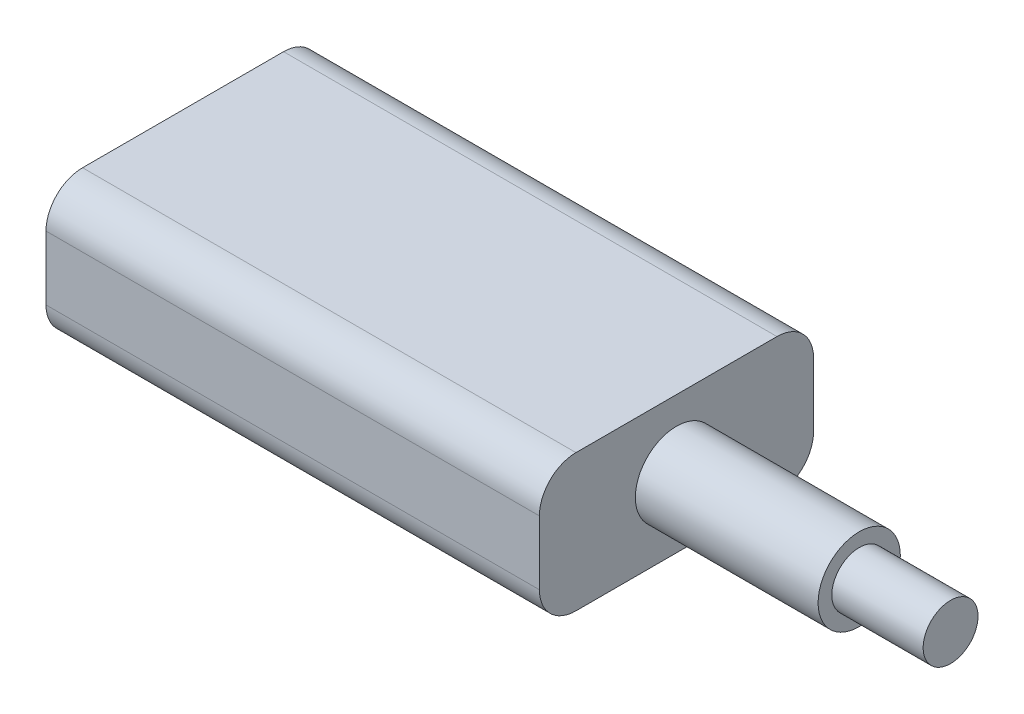
ISO-10303-21;
HEADER;
FILE_DESCRIPTION(('STEP AP214'),'2;1');
FILE_NAME('part.step','',(''),(''),'','','');
FILE_SCHEMA(('AUTOMOTIVE_DESIGN { 1 0 10303 214 1 1 1 1 }'));
ENDSEC;
DATA;
#1=APPLICATION_CONTEXT('core data for automotive mechanical design processes');
#2=APPLICATION_PROTOCOL_DEFINITION('international standard','automotive_design',2000,#1);
#3=PRODUCT_CONTEXT('',#1,'mechanical');
#4=PRODUCT('Part','Part','',(#3));
#5=PRODUCT_RELATED_PRODUCT_CATEGORY('part','',(#4));
#6=PRODUCT_DEFINITION_FORMATION('','',#4);
#7=PRODUCT_DEFINITION_CONTEXT('part definition',#1,'design');
#8=PRODUCT_DEFINITION('design','',#6,#7);
#9=PRODUCT_DEFINITION_SHAPE('','',#8);
#10=(LENGTH_UNIT() NAMED_UNIT(*) SI_UNIT(.MILLI.,.METRE.));
#11=(NAMED_UNIT(*) PLANE_ANGLE_UNIT() SI_UNIT($,.RADIAN.));
#12=(NAMED_UNIT(*) SI_UNIT($,.STERADIAN.) SOLID_ANGLE_UNIT());
#13=UNCERTAINTY_MEASURE_WITH_UNIT(LENGTH_MEASURE(1.E-05),#10,'distance_accuracy_value','');
#14=(GEOMETRIC_REPRESENTATION_CONTEXT(3) GLOBAL_UNCERTAINTY_ASSIGNED_CONTEXT((#13)) GLOBAL_UNIT_ASSIGNED_CONTEXT((#10,
#11,#12)) REPRESENTATION_CONTEXT('',''));
#15=CARTESIAN_POINT('',(0.,0.,0.));
#16=DIRECTION('',(0.,0.,1.));
#17=DIRECTION('',(1.,0.,0.));
#18=AXIS2_PLACEMENT_3D('',#15,#16,#17);
#19=CARTESIAN_POINT('',(37.,0.,0.));
#20=DIRECTION('',(1.,0.,0.));
#21=DIRECTION('',(0.,0.,-1.));
#22=AXIS2_PLACEMENT_3D('',#19,#20,#21);
#23=PLANE('',#22);
#24=CARTESIAN_POINT('',(37.,3.75,-7.5));
#25=DIRECTION('',(1.,0.,0.));
#26=DIRECTION('',(0.,0.,-1.));
#27=AXIS2_PLACEMENT_3D('',#24,#25,#26);
#28=CIRCLE('',#27,2.25);
#29=CARTESIAN_POINT('',(37.,3.75,-9.75));
#30=VERTEX_POINT('',#29);
#31=EDGE_CURVE('E168',#30,#30,#28,.T.);
#32=ORIENTED_EDGE('',*,*,#31,.T.);
#33=EDGE_LOOP('',(#32));
#34=FACE_BOUND('',#33,.T.);
#35=CARTESIAN_POINT('',(37.,3.75,-7.5));
#36=DIRECTION('',(1.,0.,0.));
#37=DIRECTION('',(0.,0.,-1.));
#38=AXIS2_PLACEMENT_3D('',#35,#36,#37);
#39=CIRCLE('',#38,1.5);
#40=CARTESIAN_POINT('',(37.,3.75,-9.));
#41=VERTEX_POINT('',#40);
#42=EDGE_CURVE('E161',#41,#41,#39,.T.);
#43=ORIENTED_EDGE('',*,*,#42,.F.);
#44=EDGE_LOOP('',(#43));
#45=FACE_BOUND('',#44,.T.);
#46=ADVANCED_FACE('F36',(#34,#45),#23,.T.);
#47=CARTESIAN_POINT('',(27.,7.5,-15.));
#48=DIRECTION('',(-1.,0.,0.));
#49=DIRECTION('',(0.,0.,1.));
#50=AXIS2_PLACEMENT_3D('',#47,#48,#49);
#51=PLANE('',#50);
#52=DIRECTION('',(0.,-1.,0.));
#53=VECTOR('',#52,1.);
#54=CARTESIAN_POINT('',(27.,7.5,0.));
#55=LINE('',#54,#53);
#56=CARTESIAN_POINT('',(27.,5.5,0.));
#57=VERTEX_POINT('',#56);
#58=CARTESIAN_POINT('',(27.,2.,0.));
#59=VERTEX_POINT('',#58);
#60=EDGE_CURVE('E194',#57,#59,#55,.T.);
#61=ORIENTED_EDGE('',*,*,#60,.T.);
#62=CARTESIAN_POINT('',(27.,2.,-2.));
#63=DIRECTION('',(-1.,0.,0.));
#64=DIRECTION('',(0.,0.,1.));
#65=AXIS2_PLACEMENT_3D('',#62,#63,#64);
#66=CIRCLE('',#65,2.);
#67=CARTESIAN_POINT('',(27.,0.,-2.));
#68=VERTEX_POINT('',#67);
#69=EDGE_CURVE('E211',#59,#68,#66,.F.);
#70=ORIENTED_EDGE('',*,*,#69,.T.);
#71=DIRECTION('',(0.,0.,-1.));
#72=VECTOR('',#71,1.);
#73=CARTESIAN_POINT('',(27.,0.,-15.));
#74=LINE('',#73,#72);
#75=CARTESIAN_POINT('',(27.,0.,-13.));
#76=VERTEX_POINT('',#75);
#77=EDGE_CURVE('E173',#68,#76,#74,.T.);
#78=ORIENTED_EDGE('',*,*,#77,.T.);
#79=CARTESIAN_POINT('',(27.,2.,-13.));
#80=DIRECTION('',(-1.,0.,0.));
#81=DIRECTION('',(0.,0.,1.));
#82=AXIS2_PLACEMENT_3D('',#79,#80,#81);
#83=CIRCLE('',#82,2.);
#84=CARTESIAN_POINT('',(27.,2.,-15.));
#85=VERTEX_POINT('',#84);
#86=EDGE_CURVE('E209',#76,#85,#83,.F.);
#87=ORIENTED_EDGE('',*,*,#86,.T.);
#88=DIRECTION('',(0.,-1.,0.));
#89=VECTOR('',#88,1.);
#90=CARTESIAN_POINT('',(27.,7.5,-15.));
#91=LINE('',#90,#89);
#92=CARTESIAN_POINT('',(27.,5.5,-15.));
#93=VERTEX_POINT('',#92);
#94=EDGE_CURVE('E191',#93,#85,#91,.T.);
#95=ORIENTED_EDGE('',*,*,#94,.F.);
#96=CARTESIAN_POINT('',(27.,5.5,-13.));
#97=DIRECTION('',(-1.,0.,0.));
#98=DIRECTION('',(0.,0.,1.));
#99=AXIS2_PLACEMENT_3D('',#96,#97,#98);
#100=CIRCLE('',#99,2.);
#101=CARTESIAN_POINT('',(27.,7.5,-13.));
#102=VERTEX_POINT('',#101);
#103=EDGE_CURVE('E205',#93,#102,#100,.F.);
#104=ORIENTED_EDGE('',*,*,#103,.T.);
#105=DIRECTION('',(0.,0.,-1.));
#106=VECTOR('',#105,1.);
#107=CARTESIAN_POINT('',(27.,7.5,-15.));
#108=LINE('',#107,#106);
#109=CARTESIAN_POINT('',(27.,7.5,-2.));
#110=VERTEX_POINT('',#109);
#111=EDGE_CURVE('E174',#110,#102,#108,.T.);
#112=ORIENTED_EDGE('',*,*,#111,.F.);
#113=CARTESIAN_POINT('',(27.,5.5,-2.));
#114=DIRECTION('',(-1.,0.,0.));
#115=DIRECTION('',(0.,0.,1.));
#116=AXIS2_PLACEMENT_3D('',#113,#114,#115);
#117=CIRCLE('',#116,2.);
#118=EDGE_CURVE('E207',#110,#57,#117,.F.);
#119=ORIENTED_EDGE('',*,*,#118,.T.);
#120=EDGE_LOOP('',(#61,#70,#78,#87,#95,#104,#112,#119));
#121=FACE_BOUND('',#120,.T.);
#122=CARTESIAN_POINT('',(27.,3.75,-7.5));
#123=DIRECTION('',(-1.,0.,0.));
#124=DIRECTION('',(0.,0.,1.));
#125=AXIS2_PLACEMENT_3D('',#122,#123,#124);
#126=CIRCLE('',#125,2.25);
#127=CARTESIAN_POINT('',(27.,3.75,-5.25));
#128=VERTEX_POINT('',#127);
#129=EDGE_CURVE('E197',#128,#128,#126,.F.);
#130=ORIENTED_EDGE('',*,*,#129,.F.);
#131=EDGE_LOOP('',(#130));
#132=FACE_BOUND('',#131,.T.);
#133=ADVANCED_FACE('F245',(#121,#132),#51,.F.);
#134=CARTESIAN_POINT('',(27.,7.5,0.));
#135=DIRECTION('',(0.,0.,-1.));
#136=DIRECTION('',(-1.,0.,0.));
#137=AXIS2_PLACEMENT_3D('',#134,#135,#136);
#138=PLANE('',#137);
#139=DIRECTION('',(0.,-1.,0.));
#140=VECTOR('',#139,1.);
#141=CARTESIAN_POINT('',(0.,7.5,0.));
#142=LINE('',#141,#140);
#143=CARTESIAN_POINT('',(0.,5.5,0.));
#144=VERTEX_POINT('',#143);
#145=CARTESIAN_POINT('',(0.,2.,0.));
#146=VERTEX_POINT('',#145);
#147=EDGE_CURVE('E181',#144,#146,#142,.T.);
#148=ORIENTED_EDGE('',*,*,#147,.T.);
#149=DIRECTION('',(1.,0.,0.));
#150=VECTOR('',#149,1.);
#151=CARTESIAN_POINT('',(27.,2.,0.));
#152=LINE('',#151,#150);
#153=EDGE_CURVE('E202',#146,#59,#152,.T.);
#154=ORIENTED_EDGE('',*,*,#153,.T.);
#155=ORIENTED_EDGE('',*,*,#60,.F.);
#156=DIRECTION('',(1.,0.,0.));
#157=VECTOR('',#156,1.);
#158=CARTESIAN_POINT('',(27.,5.5,0.));
#159=LINE('',#158,#157);
#160=EDGE_CURVE('E200',#57,#144,#159,.F.);
#161=ORIENTED_EDGE('',*,*,#160,.T.);
#162=EDGE_LOOP('',(#148,#154,#155,#161));
#163=FACE_BOUND('',#162,.T.);
#164=ADVANCED_FACE('F264',(#163),#138,.F.);
#165=CARTESIAN_POINT('',(0.,7.5,-15.));
#166=DIRECTION('',(0.,0.,1.));
#167=DIRECTION('',(1.,0.,0.));
#168=AXIS2_PLACEMENT_3D('',#165,#166,#167);
#169=PLANE('',#168);
#170=ORIENTED_EDGE('',*,*,#94,.T.);
#171=DIRECTION('',(-1.,0.,0.));
#172=VECTOR('',#171,1.);
#173=CARTESIAN_POINT('',(0.,2.,-15.));
#174=LINE('',#173,#172);
#175=CARTESIAN_POINT('',(0.,2.,-15.));
#176=VERTEX_POINT('',#175);
#177=EDGE_CURVE('E226',#85,#176,#174,.T.);
#178=ORIENTED_EDGE('',*,*,#177,.T.);
#179=DIRECTION('',(0.,-1.,0.));
#180=VECTOR('',#179,1.);
#181=CARTESIAN_POINT('',(0.,7.5,-15.));
#182=LINE('',#181,#180);
#183=CARTESIAN_POINT('',(0.,5.5,-15.));
#184=VERTEX_POINT('',#183);
#185=EDGE_CURVE('E188',#184,#176,#182,.T.);
#186=ORIENTED_EDGE('',*,*,#185,.F.);
#187=DIRECTION('',(-1.,0.,0.));
#188=VECTOR('',#187,1.);
#189=CARTESIAN_POINT('',(0.,5.5,-15.));
#190=LINE('',#189,#188);
#191=EDGE_CURVE('E224',#184,#93,#190,.F.);
#192=ORIENTED_EDGE('',*,*,#191,.T.);
#193=EDGE_LOOP('',(#170,#178,#186,#192));
#194=FACE_BOUND('',#193,.T.);
#195=ADVANCED_FACE('F251',(#194),#169,.F.);
#196=CARTESIAN_POINT('',(0.,7.5,0.));
#197=DIRECTION('',(1.,0.,0.));
#198=DIRECTION('',(0.,0.,-1.));
#199=AXIS2_PLACEMENT_3D('',#196,#197,#198);
#200=PLANE('',#199);
#201=DIRECTION('',(0.,0.,1.));
#202=VECTOR('',#201,1.);
#203=CARTESIAN_POINT('',(0.,3.5,-2.));
#204=LINE('',#203,#202);
#205=CARTESIAN_POINT('',(0.,3.5,-13.));
#206=VERTEX_POINT('',#205);
#207=CARTESIAN_POINT('',(0.,3.5,-2.));
#208=VERTEX_POINT('',#207);
#209=EDGE_CURVE('E155',#206,#208,#204,.T.);
#210=ORIENTED_EDGE('',*,*,#209,.F.);
#211=DIRECTION('',(0.,-1.,0.));
#212=VECTOR('',#211,1.);
#213=CARTESIAN_POINT('',(0.,3.5,-13.));
#214=LINE('',#213,#212);
#215=CARTESIAN_POINT('',(0.,6.5,-13.));
#216=VERTEX_POINT('',#215);
#217=EDGE_CURVE('E51',#216,#206,#214,.T.);
#218=ORIENTED_EDGE('',*,*,#217,.F.);
#219=DIRECTION('',(0.,0.,-1.));
#220=VECTOR('',#219,1.);
#221=CARTESIAN_POINT('',(0.,6.5,-13.));
#222=LINE('',#221,#220);
#223=CARTESIAN_POINT('',(0.,6.5,-2.));
#224=VERTEX_POINT('',#223);
#225=EDGE_CURVE('E146',#224,#216,#222,.T.);
#226=ORIENTED_EDGE('',*,*,#225,.F.);
#227=DIRECTION('',(0.,1.,0.));
#228=VECTOR('',#227,1.);
#229=CARTESIAN_POINT('',(0.,6.5,-2.));
#230=LINE('',#229,#228);
#231=EDGE_CURVE('E149',#208,#224,#230,.T.);
#232=ORIENTED_EDGE('',*,*,#231,.F.);
#233=EDGE_LOOP('',(#210,#218,#226,#232));
#234=FACE_BOUND('',#233,.T.);
#235=DIRECTION('',(0.,0.,1.));
#236=VECTOR('',#235,1.);
#237=CARTESIAN_POINT('',(0.,0.,0.));
#238=LINE('',#237,#236);
#239=CARTESIAN_POINT('',(0.,0.,-13.));
#240=VERTEX_POINT('',#239);
#241=CARTESIAN_POINT('',(0.,0.,-2.));
#242=VERTEX_POINT('',#241);
#243=EDGE_CURVE('E178',#240,#242,#238,.T.);
#244=ORIENTED_EDGE('',*,*,#243,.T.);
#245=CARTESIAN_POINT('',(0.,2.,-2.));
#246=DIRECTION('',(1.,0.,0.));
#247=DIRECTION('',(0.,0.,-1.));
#248=AXIS2_PLACEMENT_3D('',#245,#246,#247);
#249=CIRCLE('',#248,2.);
#250=EDGE_CURVE('E222',#242,#146,#249,.F.);
#251=ORIENTED_EDGE('',*,*,#250,.T.);
#252=ORIENTED_EDGE('',*,*,#147,.F.);
#253=CARTESIAN_POINT('',(0.,5.5,-2.));
#254=DIRECTION('',(1.,0.,0.));
#255=DIRECTION('',(0.,0.,-1.));
#256=AXIS2_PLACEMENT_3D('',#253,#254,#255);
#257=CIRCLE('',#256,2.);
#258=CARTESIAN_POINT('',(0.,7.5,-2.));
#259=VERTEX_POINT('',#258);
#260=EDGE_CURVE('E219',#144,#259,#257,.F.);
#261=ORIENTED_EDGE('',*,*,#260,.T.);
#262=DIRECTION('',(0.,0.,1.));
#263=VECTOR('',#262,1.);
#264=CARTESIAN_POINT('',(0.,7.5,0.));
#265=LINE('',#264,#263);
#266=CARTESIAN_POINT('',(0.,7.5,-13.));
#267=VERTEX_POINT('',#266);
#268=EDGE_CURVE('E177',#267,#259,#265,.T.);
#269=ORIENTED_EDGE('',*,*,#268,.F.);
#270=CARTESIAN_POINT('',(0.,5.5,-13.));
#271=DIRECTION('',(1.,0.,0.));
#272=DIRECTION('',(0.,0.,-1.));
#273=AXIS2_PLACEMENT_3D('',#270,#271,#272);
#274=CIRCLE('',#273,2.);
#275=EDGE_CURVE('E217',#267,#184,#274,.F.);
#276=ORIENTED_EDGE('',*,*,#275,.T.);
#277=ORIENTED_EDGE('',*,*,#185,.T.);
#278=CARTESIAN_POINT('',(0.,2.,-13.));
#279=DIRECTION('',(1.,0.,0.));
#280=DIRECTION('',(0.,0.,-1.));
#281=AXIS2_PLACEMENT_3D('',#278,#279,#280);
#282=CIRCLE('',#281,2.);
#283=EDGE_CURVE('E59',#176,#240,#282,.F.);
#284=ORIENTED_EDGE('',*,*,#283,.T.);
#285=EDGE_LOOP('',(#244,#251,#252,#261,#269,#276,#277,#284));
#286=FACE_BOUND('',#285,.T.);
#287=ADVANCED_FACE('F237',(#234,#286),#200,.F.);
#288=CARTESIAN_POINT('',(0.,7.5,0.));
#289=DIRECTION('',(0.,-1.,0.));
#290=DIRECTION('',(0.,0.,-1.));
#291=AXIS2_PLACEMENT_3D('',#288,#289,#290);
#292=PLANE('',#291);
#293=ORIENTED_EDGE('',*,*,#268,.T.);
#294=DIRECTION('',(1.,0.,0.));
#295=VECTOR('',#294,1.);
#296=CARTESIAN_POINT('',(0.,7.5,-2.));
#297=LINE('',#296,#295);
#298=EDGE_CURVE('E11',#259,#110,#297,.T.);
#299=ORIENTED_EDGE('',*,*,#298,.T.);
#300=ORIENTED_EDGE('',*,*,#111,.T.);
#301=DIRECTION('',(-1.,0.,0.));
#302=VECTOR('',#301,1.);
#303=CARTESIAN_POINT('',(0.,7.5,-13.));
#304=LINE('',#303,#302);
#305=EDGE_CURVE('E44',#102,#267,#304,.T.);
#306=ORIENTED_EDGE('',*,*,#305,.T.);
#307=EDGE_LOOP('',(#293,#299,#300,#306));
#308=FACE_BOUND('',#307,.T.);
#309=ADVANCED_FACE('F231',(#308),#292,.F.);
#310=CARTESIAN_POINT('',(0.,0.,0.));
#311=DIRECTION('',(0.,-1.,0.));
#312=DIRECTION('',(0.,0.,-1.));
#313=AXIS2_PLACEMENT_3D('',#310,#311,#312);
#314=PLANE('',#313);
#315=ORIENTED_EDGE('',*,*,#77,.F.);
#316=DIRECTION('',(1.,0.,0.));
#317=VECTOR('',#316,1.);
#318=CARTESIAN_POINT('',(0.,0.,-2.));
#319=LINE('',#318,#317);
#320=EDGE_CURVE('E215',#68,#242,#319,.F.);
#321=ORIENTED_EDGE('',*,*,#320,.T.);
#322=ORIENTED_EDGE('',*,*,#243,.F.);
#323=DIRECTION('',(-1.,0.,0.));
#324=VECTOR('',#323,1.);
#325=CARTESIAN_POINT('',(27.,0.,-13.));
#326=LINE('',#325,#324);
#327=EDGE_CURVE('E213',#240,#76,#326,.F.);
#328=ORIENTED_EDGE('',*,*,#327,.T.);
#329=EDGE_LOOP('',(#315,#321,#322,#328));
#330=FACE_BOUND('',#329,.T.);
#331=ADVANCED_FACE('F256',(#330),#314,.T.);
#332=CARTESIAN_POINT('',(37.,3.75,-7.5));
#333=DIRECTION('',(-1.,0.,0.));
#334=DIRECTION('',(0.,0.,1.));
#335=AXIS2_PLACEMENT_3D('',#332,#333,#334);
#336=CYLINDRICAL_SURFACE('',#335,2.25);
#337=ORIENTED_EDGE('',*,*,#31,.F.);
#338=EDGE_LOOP('',(#337));
#339=FACE_BOUND('',#338,.T.);
#340=ORIENTED_EDGE('',*,*,#129,.T.);
#341=EDGE_LOOP('',(#340));
#342=FACE_BOUND('',#341,.T.);
#343=ADVANCED_FACE('F284',(#339,#342),#336,.T.);
#344=CARTESIAN_POINT('',(42.,3.75,-7.5));
#345=DIRECTION('',(-1.,0.,0.));
#346=DIRECTION('',(0.,0.,1.));
#347=AXIS2_PLACEMENT_3D('',#344,#345,#346);
#348=CYLINDRICAL_SURFACE('',#347,1.5);
#349=CARTESIAN_POINT('',(42.,3.75,-7.5));
#350=DIRECTION('',(1.,0.,0.));
#351=DIRECTION('',(0.,0.,-1.));
#352=AXIS2_PLACEMENT_3D('',#349,#350,#351);
#353=CIRCLE('',#352,1.5);
#354=CARTESIAN_POINT('',(42.,3.75,-9.));
#355=VERTEX_POINT('',#354);
#356=EDGE_CURVE('E165',#355,#355,#353,.T.);
#357=ORIENTED_EDGE('',*,*,#356,.F.);
#358=EDGE_LOOP('',(#357));
#359=FACE_BOUND('',#358,.T.);
#360=ORIENTED_EDGE('',*,*,#42,.T.);
#361=EDGE_LOOP('',(#360));
#362=FACE_BOUND('',#361,.T.);
#363=ADVANCED_FACE('F282',(#359,#362),#348,.T.);
#364=CARTESIAN_POINT('',(42.,3.75,-7.5));
#365=DIRECTION('',(1.,0.,0.));
#366=DIRECTION('',(0.,0.,-1.));
#367=AXIS2_PLACEMENT_3D('',#364,#365,#366);
#368=PLANE('',#367);
#369=ORIENTED_EDGE('',*,*,#356,.T.);
#370=EDGE_LOOP('',(#369));
#371=FACE_BOUND('',#370,.T.);
#372=ADVANCED_FACE('F313',(#371),#368,.T.);
#373=CARTESIAN_POINT('',(27.,2.,-2.));
#374=DIRECTION('',(-1.,0.,0.));
#375=DIRECTION('',(0.,0.,1.));
#376=AXIS2_PLACEMENT_3D('',#373,#374,#375);
#377=CYLINDRICAL_SURFACE('',#376,2.);
#378=ORIENTED_EDGE('',*,*,#250,.F.);
#379=ORIENTED_EDGE('',*,*,#320,.F.);
#380=ORIENTED_EDGE('',*,*,#69,.F.);
#381=ORIENTED_EDGE('',*,*,#153,.F.);
#382=EDGE_LOOP('',(#378,#379,#380,#381));
#383=FACE_BOUND('',#382,.T.);
#384=ADVANCED_FACE('F261',(#383),#377,.T.);
#385=CARTESIAN_POINT('',(0.,2.,-13.));
#386=DIRECTION('',(1.,0.,0.));
#387=DIRECTION('',(0.,0.,-1.));
#388=AXIS2_PLACEMENT_3D('',#385,#386,#387);
#389=CYLINDRICAL_SURFACE('',#388,2.);
#390=ORIENTED_EDGE('',*,*,#86,.F.);
#391=ORIENTED_EDGE('',*,*,#327,.F.);
#392=ORIENTED_EDGE('',*,*,#283,.F.);
#393=ORIENTED_EDGE('',*,*,#177,.F.);
#394=EDGE_LOOP('',(#390,#391,#392,#393));
#395=FACE_BOUND('',#394,.T.);
#396=ADVANCED_FACE('F259',(#395),#389,.T.);
#397=CARTESIAN_POINT('',(0.,5.5,-2.));
#398=DIRECTION('',(1.,0.,0.));
#399=DIRECTION('',(0.,0.,-1.));
#400=AXIS2_PLACEMENT_3D('',#397,#398,#399);
#401=CYLINDRICAL_SURFACE('',#400,2.);
#402=ORIENTED_EDGE('',*,*,#260,.F.);
#403=ORIENTED_EDGE('',*,*,#160,.F.);
#404=ORIENTED_EDGE('',*,*,#118,.F.);
#405=ORIENTED_EDGE('',*,*,#298,.F.);
#406=EDGE_LOOP('',(#402,#403,#404,#405));
#407=FACE_BOUND('',#406,.T.);
#408=ADVANCED_FACE('F243',(#407),#401,.T.);
#409=CARTESIAN_POINT('',(0.,5.5,-13.));
#410=DIRECTION('',(-1.,0.,0.));
#411=DIRECTION('',(0.,0.,1.));
#412=AXIS2_PLACEMENT_3D('',#409,#410,#411);
#413=CYLINDRICAL_SURFACE('',#412,2.);
#414=ORIENTED_EDGE('',*,*,#103,.F.);
#415=ORIENTED_EDGE('',*,*,#191,.F.);
#416=ORIENTED_EDGE('',*,*,#275,.F.);
#417=ORIENTED_EDGE('',*,*,#305,.F.);
#418=EDGE_LOOP('',(#414,#415,#416,#417));
#419=FACE_BOUND('',#418,.T.);
#420=ADVANCED_FACE('F38',(#419),#413,.T.);
#421=CARTESIAN_POINT('',(10.,3.5,-13.));
#422=DIRECTION('',(0.,0.,-1.));
#423=DIRECTION('',(-1.,0.,0.));
#424=AXIS2_PLACEMENT_3D('',#421,#422,#423);
#425=PLANE('',#424);
#426=ORIENTED_EDGE('',*,*,#217,.T.);
#427=DIRECTION('',(-1.,0.,0.));
#428=VECTOR('',#427,1.);
#429=CARTESIAN_POINT('',(10.,3.5,-13.));
#430=LINE('',#429,#428);
#431=CARTESIAN_POINT('',(10.,3.5,-13.));
#432=VERTEX_POINT('',#431);
#433=EDGE_CURVE('E124',#432,#206,#430,.T.);
#434=ORIENTED_EDGE('',*,*,#433,.F.);
#435=DIRECTION('',(0.,-1.,0.));
#436=VECTOR('',#435,1.);
#437=CARTESIAN_POINT('',(10.,3.5,-13.));
#438=LINE('',#437,#436);
#439=CARTESIAN_POINT('',(10.,6.5,-13.));
#440=VERTEX_POINT('',#439);
#441=EDGE_CURVE('E128',#440,#432,#438,.T.);
#442=ORIENTED_EDGE('',*,*,#441,.F.);
#443=DIRECTION('',(-1.,0.,0.));
#444=VECTOR('',#443,1.);
#445=CARTESIAN_POINT('',(10.,6.5,-13.));
#446=LINE('',#445,#444);
#447=EDGE_CURVE('E159',#440,#216,#446,.T.);
#448=ORIENTED_EDGE('',*,*,#447,.T.);
#449=EDGE_LOOP('',(#426,#434,#442,#448));
#450=FACE_BOUND('',#449,.T.);
#451=ADVANCED_FACE('F126',(#450),#425,.F.);
#452=CARTESIAN_POINT('',(10.,6.5,-13.));
#453=DIRECTION('',(0.,1.,0.));
#454=DIRECTION('',(0.,0.,1.));
#455=AXIS2_PLACEMENT_3D('',#452,#453,#454);
#456=PLANE('',#455);
#457=ORIENTED_EDGE('',*,*,#225,.T.);
#458=ORIENTED_EDGE('',*,*,#447,.F.);
#459=DIRECTION('',(0.,0.,-1.));
#460=VECTOR('',#459,1.);
#461=CARTESIAN_POINT('',(10.,6.5,-13.));
#462=LINE('',#461,#460);
#463=CARTESIAN_POINT('',(10.,6.5,-2.));
#464=VERTEX_POINT('',#463);
#465=EDGE_CURVE('E134',#464,#440,#462,.T.);
#466=ORIENTED_EDGE('',*,*,#465,.F.);
#467=DIRECTION('',(-1.,0.,0.));
#468=VECTOR('',#467,1.);
#469=CARTESIAN_POINT('',(10.,6.5,-2.));
#470=LINE('',#469,#468);
#471=EDGE_CURVE('E162',#464,#224,#470,.T.);
#472=ORIENTED_EDGE('',*,*,#471,.T.);
#473=EDGE_LOOP('',(#457,#458,#466,#472));
#474=FACE_BOUND('',#473,.T.);
#475=ADVANCED_FACE('F301',(#474),#456,.F.);
#476=CARTESIAN_POINT('',(10.,6.5,-2.));
#477=DIRECTION('',(0.,0.,1.));
#478=DIRECTION('',(1.,0.,0.));
#479=AXIS2_PLACEMENT_3D('',#476,#477,#478);
#480=PLANE('',#479);
#481=ORIENTED_EDGE('',*,*,#231,.T.);
#482=ORIENTED_EDGE('',*,*,#471,.F.);
#483=DIRECTION('',(0.,1.,0.));
#484=VECTOR('',#483,1.);
#485=CARTESIAN_POINT('',(10.,6.5,-2.));
#486=LINE('',#485,#484);
#487=CARTESIAN_POINT('',(10.,3.5,-2.));
#488=VERTEX_POINT('',#487);
#489=EDGE_CURVE('E142',#488,#464,#486,.T.);
#490=ORIENTED_EDGE('',*,*,#489,.F.);
#491=DIRECTION('',(-1.,0.,0.));
#492=VECTOR('',#491,1.);
#493=CARTESIAN_POINT('',(10.,3.5,-2.));
#494=LINE('',#493,#492);
#495=EDGE_CURVE('E133',#488,#208,#494,.T.);
#496=ORIENTED_EDGE('',*,*,#495,.T.);
#497=EDGE_LOOP('',(#481,#482,#490,#496));
#498=FACE_BOUND('',#497,.T.);
#499=ADVANCED_FACE('F299',(#498),#480,.F.);
#500=CARTESIAN_POINT('',(10.,3.5,-2.));
#501=DIRECTION('',(0.,-1.,0.));
#502=DIRECTION('',(0.,0.,-1.));
#503=AXIS2_PLACEMENT_3D('',#500,#501,#502);
#504=PLANE('',#503);
#505=ORIENTED_EDGE('',*,*,#209,.T.);
#506=ORIENTED_EDGE('',*,*,#495,.F.);
#507=DIRECTION('',(0.,0.,1.));
#508=VECTOR('',#507,1.);
#509=CARTESIAN_POINT('',(10.,3.5,-2.));
#510=LINE('',#509,#508);
#511=EDGE_CURVE('E137',#432,#488,#510,.T.);
#512=ORIENTED_EDGE('',*,*,#511,.F.);
#513=ORIENTED_EDGE('',*,*,#433,.T.);
#514=EDGE_LOOP('',(#505,#506,#512,#513));
#515=FACE_BOUND('',#514,.T.);
#516=ADVANCED_FACE('F138',(#515),#504,.F.);
#517=CARTESIAN_POINT('',(10.,0.,0.));
#518=DIRECTION('',(1.,0.,0.));
#519=DIRECTION('',(0.,0.,-1.));
#520=AXIS2_PLACEMENT_3D('',#517,#518,#519);
#521=PLANE('',#520);
#522=ORIENTED_EDGE('',*,*,#441,.T.);
#523=ORIENTED_EDGE('',*,*,#511,.T.);
#524=ORIENTED_EDGE('',*,*,#489,.T.);
#525=ORIENTED_EDGE('',*,*,#465,.T.);
#526=EDGE_LOOP('',(#522,#523,#524,#525));
#527=FACE_BOUND('',#526,.T.);
#528=ADVANCED_FACE('F144',(#527),#521,.F.);
#529=CLOSED_SHELL('',(#46,#133,#164,#195,#287,#309,#331,#343,#363,#372,#384,#396,#408,#420,#451,
#475,#499,#516,#528));
#530=MANIFOLD_SOLID_BREP('B2',#529);
#531=ADVANCED_BREP_SHAPE_REPRESENTATION('',(#18,#530),#14);
#532=SHAPE_DEFINITION_REPRESENTATION(#9,#531);
ENDSEC;
END-ISO-10303-21;
